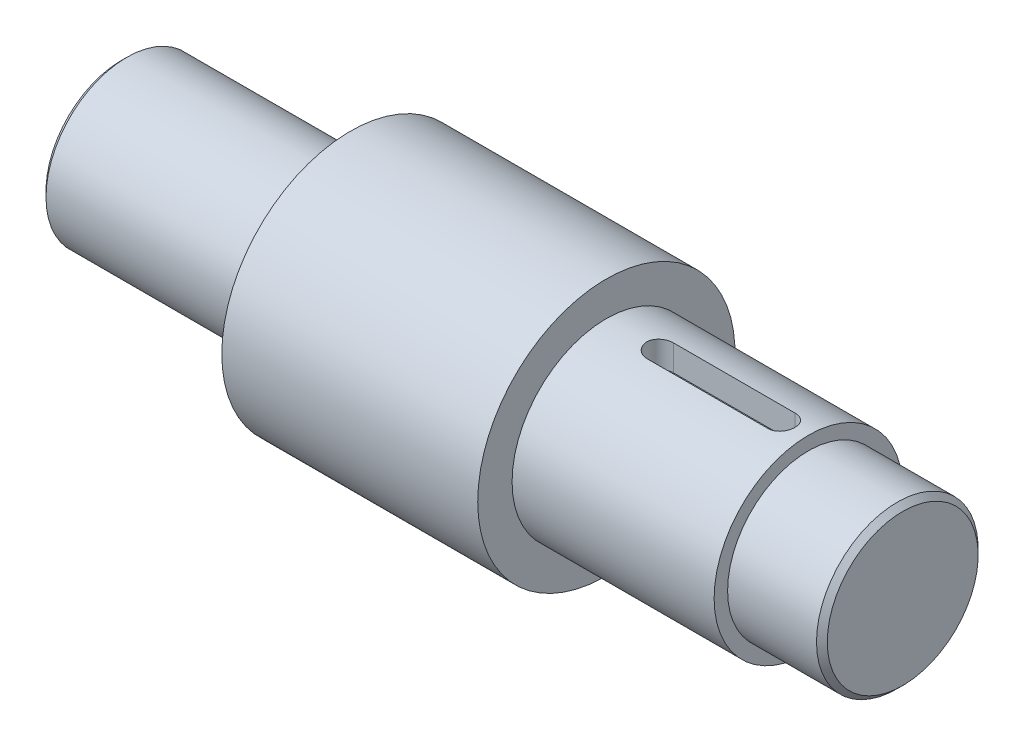
ISO-10303-21;
HEADER;
FILE_DESCRIPTION(('STEP AP214'),'2;1');
FILE_NAME('part.step','',(''),(''),'','','');
FILE_SCHEMA(('AUTOMOTIVE_DESIGN { 1 0 10303 214 1 1 1 1 }'));
ENDSEC;
DATA;
#1=APPLICATION_CONTEXT('core data for automotive mechanical design processes');
#2=APPLICATION_PROTOCOL_DEFINITION('international standard','automotive_design',2000,#1);
#3=PRODUCT_CONTEXT('',#1,'mechanical');
#4=PRODUCT('Part','Part','',(#3));
#5=PRODUCT_RELATED_PRODUCT_CATEGORY('part','',(#4));
#6=PRODUCT_DEFINITION_FORMATION('','',#4);
#7=PRODUCT_DEFINITION_CONTEXT('part definition',#1,'design');
#8=PRODUCT_DEFINITION('design','',#6,#7);
#9=PRODUCT_DEFINITION_SHAPE('','',#8);
#10=(LENGTH_UNIT() NAMED_UNIT(*) SI_UNIT(.MILLI.,.METRE.));
#11=(NAMED_UNIT(*) PLANE_ANGLE_UNIT() SI_UNIT($,.RADIAN.));
#12=(NAMED_UNIT(*) SI_UNIT($,.STERADIAN.) SOLID_ANGLE_UNIT());
#13=UNCERTAINTY_MEASURE_WITH_UNIT(LENGTH_MEASURE(1.E-05),#10,'distance_accuracy_value','');
#14=(GEOMETRIC_REPRESENTATION_CONTEXT(3) GLOBAL_UNCERTAINTY_ASSIGNED_CONTEXT((#13)) GLOBAL_UNIT_ASSIGNED_CONTEXT((#10,
#11,#12)) REPRESENTATION_CONTEXT('',''));
#15=CARTESIAN_POINT('',(0.,0.,0.));
#16=DIRECTION('',(0.,0.,1.));
#17=DIRECTION('',(1.,0.,0.));
#18=AXIS2_PLACEMENT_3D('',#15,#16,#17);
#19=CARTESIAN_POINT('',(0.,0.,0.));
#20=DIRECTION('',(-1.,0.,0.));
#21=DIRECTION('',(0.,0.,1.));
#22=AXIS2_PLACEMENT_3D('',#19,#20,#21);
#23=CYLINDRICAL_SURFACE('',#22,35.);
#24=CARTESIAN_POINT('',(255.,0.,0.));
#25=DIRECTION('',(-1.,0.,0.));
#26=DIRECTION('',(0.,0.,1.));
#27=AXIS2_PLACEMENT_3D('',#24,#25,#26);
#28=CIRCLE('',#27,35.);
#29=CARTESIAN_POINT('',(255.,0.,35.));
#30=VERTEX_POINT('',#29);
#31=EDGE_CURVE('E133',#30,#30,#28,.T.);
#32=ORIENTED_EDGE('',*,*,#31,.T.);
#33=EDGE_LOOP('',(#32));
#34=FACE_BOUND('',#33,.T.);
#35=CARTESIAN_POINT('',(180.,0.,0.));
#36=DIRECTION('',(-1.,0.,0.));
#37=DIRECTION('',(0.,0.,1.));
#38=AXIS2_PLACEMENT_3D('',#35,#36,#37);
#39=CIRCLE('',#38,35.);
#40=CARTESIAN_POINT('',(180.,0.,35.));
#41=VERTEX_POINT('',#40);
#42=EDGE_CURVE('E130',#41,#41,#39,.T.);
#43=ORIENTED_EDGE('',*,*,#42,.F.);
#44=EDGE_LOOP('',(#43));
#45=FACE_BOUND('',#44,.T.);
#46=CARTESIAN_POINT('',(200.,34.6410161513775,-5.));
#47=CARTESIAN_POINT('',(199.86013713014,34.6410074265664,-5.00001591160609));
#48=CARTESIAN_POINT('',(199.720277510837,34.6418628978962,-4.9941321964213));
#49=CARTESIAN_POINT('',(199.441573087893,34.6452390363218,-4.97068117808166));
#50=CARTESIAN_POINT('',(199.302728197967,34.6477595601281,-4.95311488029502));
#51=CARTESIAN_POINT('',(199.027191641088,34.6543989042432,-4.90644049783823));
#52=CARTESIAN_POINT('',(198.890497735117,34.6585159299262,-4.87734537191055));
#53=CARTESIAN_POINT('',(198.620073730014,34.668226777617,-4.80783638011712));
#54=CARTESIAN_POINT('',(198.486343618984,34.6738205936951,-4.76742255969885));
#55=CARTESIAN_POINT('',(198.222775160097,34.6863257383957,-4.67556959269424));
#56=CARTESIAN_POINT('',(198.092937178491,34.6932371905609,-4.62412941221028));
#57=CARTESIAN_POINT('',(197.838023608847,34.7081826804542,-4.51058021034758));
#58=CARTESIAN_POINT('',(197.712949800907,34.7162171326476,-4.44846724801722));
#59=CARTESIAN_POINT('',(197.468531160683,34.7331754184993,-4.31405945834793));
#60=CARTESIAN_POINT('',(197.34918393862,34.7420988762964,-4.24176892866866));
#61=CARTESIAN_POINT('',(197.116937100482,34.7605903979433,-4.08746774998163));
#62=CARTESIAN_POINT('',(197.004039899125,34.7701587003217,-4.00545349554704));
#63=CARTESIAN_POINT('',(196.784852264357,34.7897281605274,-3.83177434016302));
#64=CARTESIAN_POINT('',(196.678605795539,34.7997315813871,-3.74005420538538));
#65=CARTESIAN_POINT('',(196.474163697978,34.819838695989,-3.54797943846361));
#66=CARTESIAN_POINT('',(196.375971062711,34.8299424254642,-3.44762162398605));
#67=CARTESIAN_POINT('',(196.188381848944,34.8499603272203,-3.23901821816367));
#68=CARTESIAN_POINT('',(196.098983387502,34.8598745397116,-3.13077432400568));
#69=CARTESIAN_POINT('',(195.929552709936,34.8792410034879,-2.90708649360517));
#70=CARTESIAN_POINT('',(195.8495239607,34.8886930830307,-2.79163991636531));
#71=CARTESIAN_POINT('',(195.699139594285,34.9069019613463,-2.55391081300552));
#72=CARTESIAN_POINT('',(195.628823635069,34.9156558513069,-2.43160297098167));
#73=CARTESIAN_POINT('',(195.498727672101,34.9321812362167,-2.18138458548246));
#74=CARTESIAN_POINT('',(195.438951593326,34.9399523648892,-2.05347197687735));
#75=CARTESIAN_POINT('',(195.330433312052,34.9542838427671,-1.79305177592886));
#76=CARTESIAN_POINT('',(195.28168598663,34.9608447538631,-1.66054635009832));
#77=CARTESIAN_POINT('',(195.195537840786,34.972575483058,-1.39178619617212));
#78=CARTESIAN_POINT('',(195.158141165613,34.9777447928672,-1.25553011810681));
#79=CARTESIAN_POINT('',(195.095231492506,34.9865085415971,-0.981265962444267));
#80=CARTESIAN_POINT('',(195.069635334917,34.9901139902217,-0.843277411048303));
#81=CARTESIAN_POINT('',(195.030110392626,34.9957062499125,-0.565610581296828));
#82=CARTESIAN_POINT('',(195.016185663557,34.9976924983261,-0.425931732678946));
#83=CARTESIAN_POINT('',(194.992171953147,35.0011116347866,-0.00586431750300513));
#84=CARTESIAN_POINT('',(194.999773728399,35.0000148727734,0.275859817696264));
#85=CARTESIAN_POINT('',(195.04628030583,34.993417128574,0.692958622436235));
#86=CARTESIAN_POINT('',(195.067511703732,34.9904096193072,0.830651914758027));
#87=CARTESIAN_POINT('',(195.121368170637,34.9828572627269,1.10375288113208));
#88=CARTESIAN_POINT('',(195.153989280469,34.9783129496381,1.23916133229242));
#89=CARTESIAN_POINT('',(195.230405467266,34.9678082035984,1.50676941092116));
#90=CARTESIAN_POINT('',(195.274204585901,34.9618472584846,1.63896785876358));
#91=CARTESIAN_POINT('',(195.372630920435,34.9486790308099,1.89915508431037));
#92=CARTESIAN_POINT('',(195.427254272927,34.941472193052,2.02714534505984));
#93=CARTESIAN_POINT('',(195.54717578229,34.9259802637037,2.27855871675516));
#94=CARTESIAN_POINT('',(195.612514064857,34.9176911438823,2.40196243507225));
#95=CARTESIAN_POINT('',(195.753223898937,34.9002899276744,2.64278920329119));
#96=CARTESIAN_POINT('',(195.828591845737,34.8911781273401,2.76021438104537));
#97=CARTESIAN_POINT('',(195.988879441361,34.8723780906912,2.9883701286711));
#98=CARTESIAN_POINT('',(196.073802639845,34.862689640792,3.09909818700129));
#99=CARTESIAN_POINT('',(196.252555918558,34.8430115103493,3.31301745669486));
#100=CARTESIAN_POINT('',(196.346382791773,34.8330219391446,3.41621135826761));
#101=CARTESIAN_POINT('',(196.543225144791,34.8129232016131,3.61531239790413));
#102=CARTESIAN_POINT('',(196.646317057547,34.8028137791504,3.7111439611497));
#103=CARTESIAN_POINT('',(196.86018595157,34.782856463856,3.89375556691144));
#104=CARTESIAN_POINT('',(196.97096011849,34.7730084770581,3.98053889533097));
#105=CARTESIAN_POINT('',(197.199534801675,34.7538433823067,4.14453775247479));
#106=CARTESIAN_POINT('',(197.317339962953,34.7445266334411,4.22174685000006));
#107=CARTESIAN_POINT('',(197.55904280096,34.7267008897545,4.36595053759946));
#108=CARTESIAN_POINT('',(197.682938168746,34.7181915923405,4.43294895988162));
#109=CARTESIAN_POINT('',(197.936200423943,34.7022084831121,4.55638101417905));
#110=CARTESIAN_POINT('',(198.06557590553,34.6947363827498,4.61279723741337));
#111=CARTESIAN_POINT('',(198.328641884319,34.6810639034068,4.71449254347008));
#112=CARTESIAN_POINT('',(198.462330705575,34.6748630372147,4.75977589439128));
#113=CARTESIAN_POINT('',(198.732965317985,34.6639166201668,4.83885086277452));
#114=CARTESIAN_POINT('',(198.869907481073,34.6591695232742,4.87265469253469));
#115=CARTESIAN_POINT('',(199.146147504747,34.6512628647286,4.92856779191837));
#116=CARTESIAN_POINT('',(199.285444194871,34.6481025369505,4.95068270546622));
#117=CARTESIAN_POINT('',(199.520836093054,34.6441985241636,4.97791444832832));
#118=CARTESIAN_POINT('',(199.616569017535,34.6430058056928,4.98620122905195));
#119=CARTESIAN_POINT('',(199.808198159406,34.6414144704798,4.99724042253171));
#120=CARTESIAN_POINT('',(199.904093830325,34.6410145198501,5.00000213168027));
#121=CARTESIAN_POINT('',(200.,34.6410161513775,5.));
#122=B_SPLINE_CURVE_WITH_KNOTS('',3,(#46,#47,#48,#49,#50,#51,#52,#53,#54,#55,#56,#57,#58,#59,
#60,#61,#62,#63,#64,#65,#66,#67,#68,#69,#70,#71,#72,#73,#74,#75,#76,#77,#78,#79,#80,#81,#82,#83,
#84,#85,#86,#87,#88,#89,#90,#91,#92,#93,#94,#95,#96,#97,#98,#99,#100,#101,#102,#103,#104,#105,
#106,#107,#108,#109,#110,#111,#112,#113,#114,#115,#116,#117,#118,#119,#120,#121),.UNSPECIFIED.,
.F.,.F.,(4,2,2,2,2,2,2,2,2,2,2,2,2,2,2,2,2,2,2,2,2,2,2,2,2,2,2,2,2,2,2,2,2,2,2,2,2,4),(0.,
0.41945750442755,0.838878916264138,1.25783021736529,1.67677983629285,2.09576875564577,
2.51491272149804,2.9338802242379,3.35300356322365,3.77465530674552,4.19646306760925,
4.61818031660513,5.04005311532272,5.46360051591416,5.88730531094325,6.31081288662701,
6.73447494139584,7.15510396083441,7.57587908162223,8.41650255158319,8.83419175672139,
9.25173591345831,9.66943125746005,10.0869777845084,10.5061252433667,10.9251224632684,
11.3442758527032,11.7632788362145,12.1861276250699,12.6088223158482,13.0317994183618,
13.4546173786712,13.8781249308192,14.3014698653897,14.7243630101806,15.1470517765422,
15.4351941868566,15.7228513644678),.UNSPECIFIED.);
#123=CARTESIAN_POINT('',(200.,34.6410161513775,-5.));
#124=VERTEX_POINT('',#123);
#125=CARTESIAN_POINT('',(200.,34.6410161513775,5.));
#126=VERTEX_POINT('',#125);
#127=EDGE_CURVE('E76',#124,#126,#122,.T.);
#128=ORIENTED_EDGE('',*,*,#127,.F.);
#129=DIRECTION('',(-1.,0.,0.));
#130=VECTOR('',#129,1.);
#131=CARTESIAN_POINT('',(0.,34.6410161513775,-5.));
#132=LINE('',#131,#130);
#133=CARTESIAN_POINT('',(245.,34.6410161513775,-5.));
#134=VERTEX_POINT('',#133);
#135=EDGE_CURVE('E13',#134,#124,#132,.T.);
#136=ORIENTED_EDGE('',*,*,#135,.F.);
#137=CARTESIAN_POINT('',(245.,34.6410161513775,-5.));
#138=CARTESIAN_POINT('',(245.13986286986,34.6410074265664,-5.00001591160609));
#139=CARTESIAN_POINT('',(245.279722489163,34.6418628978962,-4.9941321964213));
#140=CARTESIAN_POINT('',(245.558426912107,34.6452390363218,-4.97068117808166));
#141=CARTESIAN_POINT('',(245.697271802033,34.6477595601281,-4.95311488029502));
#142=CARTESIAN_POINT('',(245.972808358912,34.6543989042432,-4.90644049783823));
#143=CARTESIAN_POINT('',(246.109502264883,34.6585159299262,-4.87734537191055));
#144=CARTESIAN_POINT('',(246.379926269986,34.668226777617,-4.80783638011712));
#145=CARTESIAN_POINT('',(246.513656381016,34.6738205936951,-4.76742255969885));
#146=CARTESIAN_POINT('',(246.777224839904,34.6863257383957,-4.67556959269424));
#147=CARTESIAN_POINT('',(246.907062821509,34.6932371905609,-4.62412941221028));
#148=CARTESIAN_POINT('',(247.161976391153,34.7081826804542,-4.51058021034758));
#149=CARTESIAN_POINT('',(247.287050199093,34.7162171326476,-4.44846724801722));
#150=CARTESIAN_POINT('',(247.531468839317,34.7331754184993,-4.31405945834793));
#151=CARTESIAN_POINT('',(247.65081606138,34.7420988762964,-4.24176892866866));
#152=CARTESIAN_POINT('',(247.883062899518,34.7605903979433,-4.08746774998163));
#153=CARTESIAN_POINT('',(247.995960100875,34.7701587003217,-4.00545349554704));
#154=CARTESIAN_POINT('',(248.215147735643,34.7897281605274,-3.83177434016303));
#155=CARTESIAN_POINT('',(248.321394204461,34.7997315813871,-3.74005420538539));
#156=CARTESIAN_POINT('',(248.525836302022,34.819838695989,-3.54797943846362));
#157=CARTESIAN_POINT('',(248.624028937289,34.8299424254642,-3.44762162398605));
#158=CARTESIAN_POINT('',(248.811618151056,34.8499603272203,-3.23901821816366));
#159=CARTESIAN_POINT('',(248.901016612498,34.8598745397116,-3.13077432400568));
#160=CARTESIAN_POINT('',(249.070447290064,34.8792410034879,-2.90708649360517));
#161=CARTESIAN_POINT('',(249.1504760393,34.8886930830307,-2.79163991636532));
#162=CARTESIAN_POINT('',(249.300860405715,34.9069019613463,-2.55391081300552));
#163=CARTESIAN_POINT('',(249.371176364931,34.9156558513069,-2.43160297098167));
#164=CARTESIAN_POINT('',(249.501272327899,34.9321812362167,-2.18138458548247));
#165=CARTESIAN_POINT('',(249.561048406674,34.9399523648892,-2.05347197687736));
#166=CARTESIAN_POINT('',(249.669566687948,34.9542838427671,-1.79305177592888));
#167=CARTESIAN_POINT('',(249.71831401337,34.9608447538631,-1.66054635009833));
#168=CARTESIAN_POINT('',(249.804462159214,34.972575483058,-1.39178619617213));
#169=CARTESIAN_POINT('',(249.841858834387,34.9777447928672,-1.25553011810682));
#170=CARTESIAN_POINT('',(249.904768507494,34.9865085415971,-0.981265962444281));
#171=CARTESIAN_POINT('',(249.930364665083,34.9901139902217,-0.843277411048318));
#172=CARTESIAN_POINT('',(249.969889607374,34.9957062499125,-0.565610581296841));
#173=CARTESIAN_POINT('',(249.983814336443,34.9976924983261,-0.425931732678955));
#174=CARTESIAN_POINT('',(250.007828046853,35.0011116347866,-0.00586431750300979));
#175=CARTESIAN_POINT('',(250.000226271601,35.0000148727734,0.275859817696261));
#176=CARTESIAN_POINT('',(249.95371969417,34.993417128574,0.692958622436233));
#177=CARTESIAN_POINT('',(249.932488296268,34.9904096193072,0.830651914758026));
#178=CARTESIAN_POINT('',(249.878631829363,34.9828572627269,1.10375288113208));
#179=CARTESIAN_POINT('',(249.846010719531,34.9783129496381,1.23916133229242));
#180=CARTESIAN_POINT('',(249.769594532734,34.9678082035984,1.50676941092115));
#181=CARTESIAN_POINT('',(249.725795414099,34.9618472584846,1.63896785876357));
#182=CARTESIAN_POINT('',(249.627369079565,34.9486790308099,1.89915508431036));
#183=CARTESIAN_POINT('',(249.572745727073,34.941472193052,2.02714534505984));
#184=CARTESIAN_POINT('',(249.45282421771,34.9259802637037,2.27855871675515));
#185=CARTESIAN_POINT('',(249.387485935143,34.9176911438823,2.40196243507225));
#186=CARTESIAN_POINT('',(249.246776101063,34.9002899276744,2.64278920329118));
#187=CARTESIAN_POINT('',(249.171408154263,34.8911781273401,2.76021438104535));
#188=CARTESIAN_POINT('',(249.011120558639,34.8723780906912,2.98837012867109));
#189=CARTESIAN_POINT('',(248.926197360155,34.862689640792,3.09909818700128));
#190=CARTESIAN_POINT('',(248.747444081442,34.8430115103493,3.31301745669486));
#191=CARTESIAN_POINT('',(248.653617208227,34.8330219391446,3.4162113582676));
#192=CARTESIAN_POINT('',(248.456774855209,34.8129232016131,3.61531239790414));
#193=CARTESIAN_POINT('',(248.353682942453,34.8028137791504,3.71114396114973));
#194=CARTESIAN_POINT('',(248.13981404843,34.782856463856,3.89375556691147));
#195=CARTESIAN_POINT('',(248.02903988151,34.7730084770581,3.980538895331));
#196=CARTESIAN_POINT('',(247.800465198325,34.7538433823067,4.14453775247481));
#197=CARTESIAN_POINT('',(247.682660037047,34.7445266334411,4.22174685000007));
#198=CARTESIAN_POINT('',(247.44095719904,34.7267008897545,4.36595053759946));
#199=CARTESIAN_POINT('',(247.317061831254,34.7181915923405,4.43294895988162));
#200=CARTESIAN_POINT('',(247.063799576057,34.7022084831121,4.55638101417904));
#201=CARTESIAN_POINT('',(246.93442409447,34.6947363827498,4.61279723741336));
#202=CARTESIAN_POINT('',(246.671358115681,34.6810639034068,4.71449254347008));
#203=CARTESIAN_POINT('',(246.537669294425,34.6748630372147,4.75977589439127));
#204=CARTESIAN_POINT('',(246.267034682015,34.6639166201668,4.83885086277452));
#205=CARTESIAN_POINT('',(246.130092518927,34.6591695232742,4.87265469253469));
#206=CARTESIAN_POINT('',(245.853852495253,34.6512628647286,4.92856779191837));
#207=CARTESIAN_POINT('',(245.714555805129,34.6481025369505,4.95068270546622));
#208=CARTESIAN_POINT('',(245.479163906946,34.6441985241636,4.97791444832832));
#209=CARTESIAN_POINT('',(245.383430982465,34.6430058056928,4.98620122905195));
#210=CARTESIAN_POINT('',(245.191801840594,34.6414144704798,4.99724042253171));
#211=CARTESIAN_POINT('',(245.095906169675,34.6410145198501,5.00000213168027));
#212=CARTESIAN_POINT('',(245.,34.6410161513775,5.));
#213=B_SPLINE_CURVE_WITH_KNOTS('',3,(#137,#138,#139,#140,#141,#142,#143,#144,#145,#146,#147,
#148,#149,#150,#151,#152,#153,#154,#155,#156,#157,#158,#159,#160,#161,#162,#163,#164,#165,#166,
#167,#168,#169,#170,#171,#172,#173,#174,#175,#176,#177,#178,#179,#180,#181,#182,#183,#184,#185,
#186,#187,#188,#189,#190,#191,#192,#193,#194,#195,#196,#197,#198,#199,#200,#201,#202,#203,#204,
#205,#206,#207,#208,#209,#210,#211,#212),.UNSPECIFIED.,.F.,.F.,(4,2,2,2,2,2,2,2,2,2,2,2,2,2,2,2,
2,2,2,2,2,2,2,2,2,2,2,2,2,2,2,2,2,2,2,2,2,4),(0.,0.41945750442755,0.838878916264138,
1.25783021736529,1.67677983629285,2.09576875564577,2.51491272149804,2.9338802242379,
3.35300356322365,3.77465530674551,4.19646306760925,4.61818031660513,5.04005311532272,
5.46360051591415,5.88730531094323,6.31081288662701,6.73447494139582,7.15510396083439,
7.57587908162222,8.41650255158319,8.83419175672138,9.2517359134583,9.66943125746003,
10.0869777845084,10.5061252433667,10.9251224632684,11.3442758527032,11.7632788362145,
12.18612762507,12.6088223158482,13.0317994183618,13.4546173786712,13.8781249308192,
14.3014698653897,14.7243630101806,15.1470517765422,15.4351941868565,15.7228513644678),.UNSPECIFIED.);
#214=CARTESIAN_POINT('',(245.,34.6410161513775,5.));
#215=VERTEX_POINT('',#214);
#216=EDGE_CURVE('E151',#134,#215,#213,.T.);
#217=ORIENTED_EDGE('',*,*,#216,.T.);
#218=DIRECTION('',(-1.,0.,0.));
#219=VECTOR('',#218,1.);
#220=CARTESIAN_POINT('',(0.,34.6410161513775,5.));
#221=LINE('',#220,#219);
#222=EDGE_CURVE('E61',#215,#126,#221,.T.);
#223=ORIENTED_EDGE('',*,*,#222,.T.);
#224=EDGE_LOOP('',(#128,#136,#217,#223));
#225=FACE_BOUND('',#224,.T.);
#226=ADVANCED_FACE('F53',(#34,#45,#225),#23,.T.);
#227=CARTESIAN_POINT('',(0.,30.,0.));
#228=DIRECTION('',(1.,0.,0.));
#229=DIRECTION('',(0.,0.,-1.));
#230=AXIS2_PLACEMENT_3D('',#227,#228,#229);
#231=PLANE('',#230);
#232=CARTESIAN_POINT('',(0.,0.,0.));
#233=DIRECTION('',(1.,0.,0.));
#234=DIRECTION('',(0.,0.,-1.));
#235=AXIS2_PLACEMENT_3D('',#232,#233,#234);
#236=CIRCLE('',#235,28.);
#237=CARTESIAN_POINT('',(0.,0.,-28.));
#238=VERTEX_POINT('',#237);
#239=EDGE_CURVE('E145',#238,#238,#236,.F.);
#240=ORIENTED_EDGE('',*,*,#239,.T.);
#241=EDGE_LOOP('',(#240));
#242=FACE_BOUND('',#241,.T.);
#243=ADVANCED_FACE('F199',(#242),#231,.F.);
#244=CARTESIAN_POINT('',(290.,0.,0.));
#245=DIRECTION('',(-1.,0.,0.));
#246=DIRECTION('',(0.,0.,1.));
#247=AXIS2_PLACEMENT_3D('',#244,#245,#246);
#248=PLANE('',#247);
#249=CARTESIAN_POINT('',(290.,0.,0.));
#250=DIRECTION('',(-1.,0.,0.));
#251=DIRECTION('',(0.,0.,1.));
#252=AXIS2_PLACEMENT_3D('',#249,#250,#251);
#253=CIRCLE('',#252,28.);
#254=CARTESIAN_POINT('',(290.,0.,28.));
#255=VERTEX_POINT('',#254);
#256=EDGE_CURVE('E142',#255,#255,#253,.F.);
#257=ORIENTED_EDGE('',*,*,#256,.T.);
#258=EDGE_LOOP('',(#257));
#259=FACE_BOUND('',#258,.T.);
#260=ADVANCED_FACE('F204',(#259),#248,.F.);
#261=CARTESIAN_POINT('',(0.,0.,0.));
#262=DIRECTION('',(-1.,0.,0.));
#263=DIRECTION('',(0.,0.,1.));
#264=AXIS2_PLACEMENT_3D('',#261,#262,#263);
#265=CYLINDRICAL_SURFACE('',#264,30.);
#266=CARTESIAN_POINT('',(288.,0.,0.));
#267=DIRECTION('',(-1.,0.,0.));
#268=DIRECTION('',(0.,0.,1.));
#269=AXIS2_PLACEMENT_3D('',#266,#267,#268);
#270=CIRCLE('',#269,30.);
#271=CARTESIAN_POINT('',(288.,0.,30.));
#272=VERTEX_POINT('',#271);
#273=EDGE_CURVE('E139',#272,#272,#270,.T.);
#274=ORIENTED_EDGE('',*,*,#273,.T.);
#275=EDGE_LOOP('',(#274));
#276=FACE_BOUND('',#275,.T.);
#277=CARTESIAN_POINT('',(255.,0.,0.));
#278=DIRECTION('',(-1.,0.,0.));
#279=DIRECTION('',(0.,0.,1.));
#280=AXIS2_PLACEMENT_3D('',#277,#278,#279);
#281=CIRCLE('',#280,30.);
#282=CARTESIAN_POINT('',(255.,0.,30.));
#283=VERTEX_POINT('',#282);
#284=EDGE_CURVE('E136',#283,#283,#281,.T.);
#285=ORIENTED_EDGE('',*,*,#284,.F.);
#286=EDGE_LOOP('',(#285));
#287=FACE_BOUND('',#286,.T.);
#288=ADVANCED_FACE('F194',(#276,#287),#265,.T.);
#289=CARTESIAN_POINT('',(255.,35.,0.));
#290=DIRECTION('',(-1.,0.,0.));
#291=DIRECTION('',(0.,0.,1.));
#292=AXIS2_PLACEMENT_3D('',#289,#290,#291);
#293=PLANE('',#292);
#294=ORIENTED_EDGE('',*,*,#31,.F.);
#295=EDGE_LOOP('',(#294));
#296=FACE_BOUND('',#295,.T.);
#297=ORIENTED_EDGE('',*,*,#284,.T.);
#298=EDGE_LOOP('',(#297));
#299=FACE_BOUND('',#298,.T.);
#300=ADVANCED_FACE('F189',(#296,#299),#293,.F.);
#301=CARTESIAN_POINT('',(180.,47.75,0.));
#302=DIRECTION('',(-1.,0.,0.));
#303=DIRECTION('',(0.,0.,1.));
#304=AXIS2_PLACEMENT_3D('',#301,#302,#303);
#305=PLANE('',#304);
#306=CARTESIAN_POINT('',(180.,0.,0.));
#307=DIRECTION('',(-1.,0.,0.));
#308=DIRECTION('',(0.,0.,1.));
#309=AXIS2_PLACEMENT_3D('',#306,#307,#308);
#310=CIRCLE('',#309,47.75);
#311=CARTESIAN_POINT('',(180.,0.,47.75));
#312=VERTEX_POINT('',#311);
#313=EDGE_CURVE('E127',#312,#312,#310,.T.);
#314=ORIENTED_EDGE('',*,*,#313,.F.);
#315=EDGE_LOOP('',(#314));
#316=FACE_BOUND('',#315,.T.);
#317=ORIENTED_EDGE('',*,*,#42,.T.);
#318=EDGE_LOOP('',(#317));
#319=FACE_BOUND('',#318,.T.);
#320=ADVANCED_FACE('F186',(#316,#319),#305,.F.);
#321=CARTESIAN_POINT('',(0.,0.,0.));
#322=DIRECTION('',(-1.,0.,0.));
#323=DIRECTION('',(0.,0.,1.));
#324=AXIS2_PLACEMENT_3D('',#321,#322,#323);
#325=CYLINDRICAL_SURFACE('',#324,47.75);
#326=CARTESIAN_POINT('',(85.,0.,0.));
#327=DIRECTION('',(-1.,0.,0.));
#328=DIRECTION('',(0.,0.,1.));
#329=AXIS2_PLACEMENT_3D('',#326,#327,#328);
#330=CIRCLE('',#329,47.75);
#331=CARTESIAN_POINT('',(85.,0.,47.75));
#332=VERTEX_POINT('',#331);
#333=EDGE_CURVE('E124',#332,#332,#330,.T.);
#334=ORIENTED_EDGE('',*,*,#333,.F.);
#335=EDGE_LOOP('',(#334));
#336=FACE_BOUND('',#335,.T.);
#337=ORIENTED_EDGE('',*,*,#313,.T.);
#338=EDGE_LOOP('',(#337));
#339=FACE_BOUND('',#338,.T.);
#340=ADVANCED_FACE('F183',(#336,#339),#325,.T.);
#341=CARTESIAN_POINT('',(85.,47.75,0.));
#342=DIRECTION('',(1.,0.,0.));
#343=DIRECTION('',(0.,0.,-1.));
#344=AXIS2_PLACEMENT_3D('',#341,#342,#343);
#345=PLANE('',#344);
#346=CARTESIAN_POINT('',(85.,0.,0.));
#347=DIRECTION('',(-1.,0.,0.));
#348=DIRECTION('',(0.,0.,1.));
#349=AXIS2_PLACEMENT_3D('',#346,#347,#348);
#350=CIRCLE('',#349,30.);
#351=CARTESIAN_POINT('',(85.,0.,30.));
#352=VERTEX_POINT('',#351);
#353=EDGE_CURVE('E118',#352,#352,#350,.T.);
#354=ORIENTED_EDGE('',*,*,#353,.F.);
#355=EDGE_LOOP('',(#354));
#356=FACE_BOUND('',#355,.T.);
#357=ORIENTED_EDGE('',*,*,#333,.T.);
#358=EDGE_LOOP('',(#357));
#359=FACE_BOUND('',#358,.T.);
#360=ADVANCED_FACE('F179',(#356,#359),#345,.F.);
#361=CARTESIAN_POINT('',(0.,0.,0.));
#362=DIRECTION('',(-1.,0.,0.));
#363=DIRECTION('',(0.,0.,1.));
#364=AXIS2_PLACEMENT_3D('',#361,#362,#363);
#365=CYLINDRICAL_SURFACE('',#364,30.);
#366=CARTESIAN_POINT('',(1.99999999999995,0.,0.));
#367=DIRECTION('',(1.,0.,0.));
#368=DIRECTION('',(0.,0.,-1.));
#369=AXIS2_PLACEMENT_3D('',#366,#367,#368);
#370=CIRCLE('',#369,30.);
#371=CARTESIAN_POINT('',(1.99999999999995,0.,-30.));
#372=VERTEX_POINT('',#371);
#373=EDGE_CURVE('E148',#372,#372,#370,.T.);
#374=ORIENTED_EDGE('',*,*,#373,.T.);
#375=EDGE_LOOP('',(#374));
#376=FACE_BOUND('',#375,.T.);
#377=ORIENTED_EDGE('',*,*,#353,.T.);
#378=EDGE_LOOP('',(#377));
#379=FACE_BOUND('',#378,.T.);
#380=ADVANCED_FACE('F175',(#376,#379),#365,.T.);
#381=CARTESIAN_POINT('',(288.,0.,0.));
#382=DIRECTION('',(-1.,0.,0.));
#383=DIRECTION('',(0.,0.,1.));
#384=AXIS2_PLACEMENT_3D('',#381,#382,#383);
#385=CONICAL_SURFACE('',#384,30.,0.785398163397449);
#386=ORIENTED_EDGE('',*,*,#256,.F.);
#387=EDGE_LOOP('',(#386));
#388=FACE_BOUND('',#387,.T.);
#389=ORIENTED_EDGE('',*,*,#273,.F.);
#390=EDGE_LOOP('',(#389));
#391=FACE_BOUND('',#390,.T.);
#392=ADVANCED_FACE('F178',(#388,#391),#385,.T.);
#393=CARTESIAN_POINT('',(0.,0.,0.));
#394=DIRECTION('',(1.,0.,0.));
#395=DIRECTION('',(0.,0.,-1.));
#396=AXIS2_PLACEMENT_3D('',#393,#394,#395);
#397=CONICAL_SURFACE('',#396,28.,0.785398163397449);
#398=ORIENTED_EDGE('',*,*,#373,.F.);
#399=EDGE_LOOP('',(#398));
#400=FACE_BOUND('',#399,.T.);
#401=ORIENTED_EDGE('',*,*,#239,.F.);
#402=EDGE_LOOP('',(#401));
#403=FACE_BOUND('',#402,.T.);
#404=ADVANCED_FACE('F55',(#400,#403),#397,.T.);
#405=CARTESIAN_POINT('',(200.,25.,5.));
#406=DIRECTION('',(0.,0.,1.));
#407=DIRECTION('',(1.,0.,0.));
#408=AXIS2_PLACEMENT_3D('',#405,#406,#407);
#409=PLANE('',#408);
#410=DIRECTION('',(0.,1.,0.));
#411=VECTOR('',#410,1.);
#412=CARTESIAN_POINT('',(245.,25.,5.));
#413=LINE('',#412,#411);
#414=CARTESIAN_POINT('',(245.,25.,5.));
#415=VERTEX_POINT('',#414);
#416=EDGE_CURVE('E68',#415,#215,#413,.T.);
#417=ORIENTED_EDGE('',*,*,#416,.F.);
#418=DIRECTION('',(1.,0.,0.));
#419=VECTOR('',#418,1.);
#420=CARTESIAN_POINT('',(200.,25.,5.));
#421=LINE('',#420,#419);
#422=CARTESIAN_POINT('',(200.,25.,5.));
#423=VERTEX_POINT('',#422);
#424=EDGE_CURVE('E95',#423,#415,#421,.T.);
#425=ORIENTED_EDGE('',*,*,#424,.F.);
#426=DIRECTION('',(0.,1.,0.));
#427=VECTOR('',#426,1.);
#428=CARTESIAN_POINT('',(200.,25.,5.));
#429=LINE('',#428,#427);
#430=EDGE_CURVE('E116',#423,#126,#429,.T.);
#431=ORIENTED_EDGE('',*,*,#430,.T.);
#432=ORIENTED_EDGE('',*,*,#222,.F.);
#433=EDGE_LOOP('',(#417,#425,#431,#432));
#434=FACE_BOUND('',#433,.T.);
#435=ADVANCED_FACE('F93',(#434),#409,.F.);
#436=CARTESIAN_POINT('',(200.,25.,0.));
#437=DIRECTION('',(0.,1.,0.));
#438=DIRECTION('',(0.,0.,1.));
#439=AXIS2_PLACEMENT_3D('',#436,#437,#438);
#440=CYLINDRICAL_SURFACE('',#439,5.);
#441=DIRECTION('',(0.,1.,0.));
#442=VECTOR('',#441,1.);
#443=CARTESIAN_POINT('',(200.,25.,-5.));
#444=LINE('',#443,#442);
#445=CARTESIAN_POINT('',(200.,25.,-5.));
#446=VERTEX_POINT('',#445);
#447=EDGE_CURVE('E119',#446,#124,#444,.T.);
#448=ORIENTED_EDGE('',*,*,#447,.T.);
#449=ORIENTED_EDGE('',*,*,#127,.T.);
#450=ORIENTED_EDGE('',*,*,#430,.F.);
#451=CARTESIAN_POINT('',(200.,25.,0.));
#452=DIRECTION('',(0.,-1.,0.));
#453=DIRECTION('',(0.,0.,-1.));
#454=AXIS2_PLACEMENT_3D('',#451,#452,#453);
#455=CIRCLE('',#454,5.);
#456=EDGE_CURVE('E99',#423,#446,#455,.T.);
#457=ORIENTED_EDGE('',*,*,#456,.T.);
#458=EDGE_LOOP('',(#448,#449,#450,#457));
#459=FACE_BOUND('',#458,.T.);
#460=ADVANCED_FACE('F174',(#459),#440,.F.);
#461=CARTESIAN_POINT('',(200.,25.,-5.));
#462=DIRECTION('',(0.,0.,1.));
#463=DIRECTION('',(1.,0.,0.));
#464=AXIS2_PLACEMENT_3D('',#461,#462,#463);
#465=PLANE('',#464);
#466=ORIENTED_EDGE('',*,*,#135,.T.);
#467=ORIENTED_EDGE('',*,*,#447,.F.);
#468=DIRECTION('',(1.,0.,0.));
#469=VECTOR('',#468,1.);
#470=CARTESIAN_POINT('',(200.,25.,-5.));
#471=LINE('',#470,#469);
#472=CARTESIAN_POINT('',(245.,25.,-5.));
#473=VERTEX_POINT('',#472);
#474=EDGE_CURVE('E108',#446,#473,#471,.T.);
#475=ORIENTED_EDGE('',*,*,#474,.T.);
#476=DIRECTION('',(0.,1.,0.));
#477=VECTOR('',#476,1.);
#478=CARTESIAN_POINT('',(245.,25.,-5.));
#479=LINE('',#478,#477);
#480=EDGE_CURVE('E98',#473,#134,#479,.T.);
#481=ORIENTED_EDGE('',*,*,#480,.T.);
#482=EDGE_LOOP('',(#466,#467,#475,#481));
#483=FACE_BOUND('',#482,.T.);
#484=ADVANCED_FACE('F171',(#483),#465,.T.);
#485=CARTESIAN_POINT('',(245.,25.,0.));
#486=DIRECTION('',(0.,1.,0.));
#487=DIRECTION('',(0.,0.,1.));
#488=AXIS2_PLACEMENT_3D('',#485,#486,#487);
#489=CYLINDRICAL_SURFACE('',#488,5.);
#490=ORIENTED_EDGE('',*,*,#480,.F.);
#491=CARTESIAN_POINT('',(245.,25.,0.));
#492=DIRECTION('',(0.,1.,0.));
#493=DIRECTION('',(0.,0.,1.));
#494=AXIS2_PLACEMENT_3D('',#491,#492,#493);
#495=CIRCLE('',#494,5.);
#496=EDGE_CURVE('E103',#415,#473,#495,.T.);
#497=ORIENTED_EDGE('',*,*,#496,.F.);
#498=ORIENTED_EDGE('',*,*,#416,.T.);
#499=ORIENTED_EDGE('',*,*,#216,.F.);
#500=EDGE_LOOP('',(#490,#497,#498,#499));
#501=FACE_BOUND('',#500,.T.);
#502=ADVANCED_FACE('F104',(#501),#489,.F.);
#503=CARTESIAN_POINT('',(245.,25.,0.));
#504=DIRECTION('',(0.,1.,0.));
#505=DIRECTION('',(0.,0.,1.));
#506=AXIS2_PLACEMENT_3D('',#503,#504,#505);
#507=PLANE('',#506);
#508=ORIENTED_EDGE('',*,*,#424,.T.);
#509=ORIENTED_EDGE('',*,*,#496,.T.);
#510=ORIENTED_EDGE('',*,*,#474,.F.);
#511=ORIENTED_EDGE('',*,*,#456,.F.);
#512=EDGE_LOOP('',(#508,#509,#510,#511));
#513=FACE_BOUND('',#512,.T.);
#514=ADVANCED_FACE('F111',(#513),#507,.T.);
#515=CLOSED_SHELL('',(#226,#243,#260,#288,#300,#320,#340,#360,#380,#392,#404,#435,#460,#484,
#502,#514));
#516=MANIFOLD_SOLID_BREP('B2',#515);
#517=ADVANCED_BREP_SHAPE_REPRESENTATION('',(#18,#516),#14);
#518=SHAPE_DEFINITION_REPRESENTATION(#9,#517);
ENDSEC;
END-ISO-10303-21;
